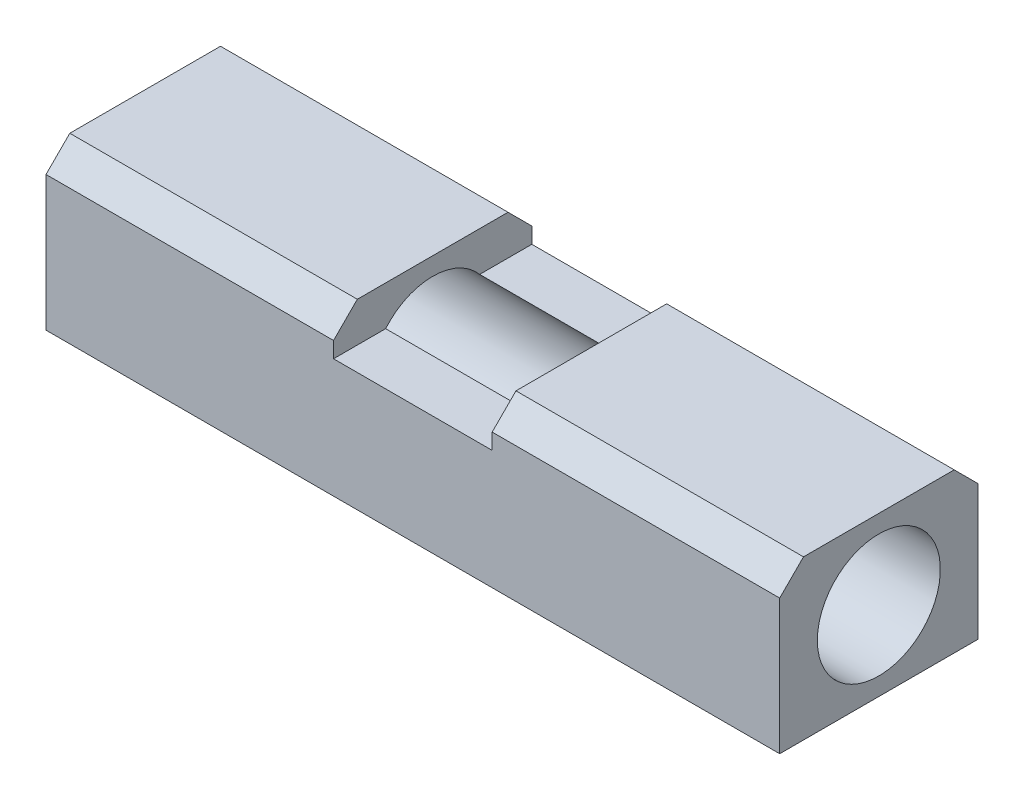
ISO-10303-21;
HEADER;
FILE_DESCRIPTION(('STEP AP214'),'2;1');
FILE_NAME('part.step','',(''),(''),'','','');
FILE_SCHEMA(('AUTOMOTIVE_DESIGN { 1 0 10303 214 1 1 1 1 }'));
ENDSEC;
DATA;
#1=APPLICATION_CONTEXT('core data for automotive mechanical design processes');
#2=APPLICATION_PROTOCOL_DEFINITION('international standard','automotive_design',2000,#1);
#3=PRODUCT_CONTEXT('',#1,'mechanical');
#4=PRODUCT('Part','Part','',(#3));
#5=PRODUCT_RELATED_PRODUCT_CATEGORY('part','',(#4));
#6=PRODUCT_DEFINITION_FORMATION('','',#4);
#7=PRODUCT_DEFINITION_CONTEXT('part definition',#1,'design');
#8=PRODUCT_DEFINITION('design','',#6,#7);
#9=PRODUCT_DEFINITION_SHAPE('','',#8);
#10=(LENGTH_UNIT() NAMED_UNIT(*) SI_UNIT(.MILLI.,.METRE.));
#11=(NAMED_UNIT(*) PLANE_ANGLE_UNIT() SI_UNIT($,.RADIAN.));
#12=(NAMED_UNIT(*) SI_UNIT($,.STERADIAN.) SOLID_ANGLE_UNIT());
#13=UNCERTAINTY_MEASURE_WITH_UNIT(LENGTH_MEASURE(1.E-05),#10,'distance_accuracy_value','');
#14=(GEOMETRIC_REPRESENTATION_CONTEXT(3) GLOBAL_UNCERTAINTY_ASSIGNED_CONTEXT((#13)) GLOBAL_UNIT_ASSIGNED_CONTEXT((#10,
#11,#12)) REPRESENTATION_CONTEXT('',''));
#15=CARTESIAN_POINT('',(0.,0.,0.));
#16=DIRECTION('',(0.,0.,1.));
#17=DIRECTION('',(1.,0.,0.));
#18=AXIS2_PLACEMENT_3D('',#15,#16,#17);
#19=CARTESIAN_POINT('',(0.,40.,50.));
#20=DIRECTION('',(0.,-1.,0.));
#21=DIRECTION('',(0.,0.,-1.));
#22=AXIS2_PLACEMENT_3D('',#19,#20,#21);
#23=PLANE('',#22);
#24=DIRECTION('',(1.,0.,0.));
#25=VECTOR('',#24,1.);
#26=CARTESIAN_POINT('',(0.,40.,44.));
#27=LINE('',#26,#25);
#28=CARTESIAN_POINT('',(0.,40.,44.));
#29=VERTEX_POINT('',#28);
#30=CARTESIAN_POINT('',(72.5,40.,44.));
#31=VERTEX_POINT('',#30);
#32=EDGE_CURVE('E250',#29,#31,#27,.T.);
#33=ORIENTED_EDGE('',*,*,#32,.T.);
#34=DIRECTION('',(0.,0.,1.));
#35=VECTOR('',#34,1.);
#36=CARTESIAN_POINT('',(72.5,40.,0.));
#37=LINE('',#36,#35);
#38=CARTESIAN_POINT('',(72.5,40.,6.00000000000001));
#39=VERTEX_POINT('',#38);
#40=EDGE_CURVE('E169',#39,#31,#37,.T.);
#41=ORIENTED_EDGE('',*,*,#40,.F.);
#42=DIRECTION('',(-1.,0.,0.));
#43=VECTOR('',#42,1.);
#44=CARTESIAN_POINT('',(0.,40.,6.00000000000001));
#45=LINE('',#44,#43);
#46=CARTESIAN_POINT('',(0.,40.,6.));
#47=VERTEX_POINT('',#46);
#48=EDGE_CURVE('E245',#39,#47,#45,.T.);
#49=ORIENTED_EDGE('',*,*,#48,.T.);
#50=DIRECTION('',(0.,0.,-1.));
#51=VECTOR('',#50,1.);
#52=CARTESIAN_POINT('',(0.,40.,50.));
#53=LINE('',#52,#51);
#54=EDGE_CURVE('E220',#29,#47,#53,.T.);
#55=ORIENTED_EDGE('',*,*,#54,.F.);
#56=EDGE_LOOP('',(#33,#41,#49,#55));
#57=FACE_BOUND('',#56,.T.);
#58=ADVANCED_FACE('F33',(#57),#23,.F.);
#59=CARTESIAN_POINT('',(0.,34.,50.));
#60=DIRECTION('',(0.,-0.707106781186549,-0.707106781186546));
#61=DIRECTION('',(0.,0.707106781186546,-0.707106781186549));
#62=AXIS2_PLACEMENT_3D('',#59,#60,#61);
#63=PLANE('',#62);
#64=DIRECTION('',(0.,0.707106781186546,-0.707106781186549));
#65=VECTOR('',#64,1.);
#66=CARTESIAN_POINT('',(72.5,34.,50.));
#67=LINE('',#66,#65);
#68=CARTESIAN_POINT('',(72.5,34.,50.));
#69=VERTEX_POINT('',#68);
#70=EDGE_CURVE('E178',#31,#69,#67,.F.);
#71=ORIENTED_EDGE('',*,*,#70,.F.);
#72=ORIENTED_EDGE('',*,*,#32,.F.);
#73=DIRECTION('',(0.,-0.707106781186546,0.707106781186549));
#74=VECTOR('',#73,1.);
#75=CARTESIAN_POINT('',(0.,34.,50.));
#76=LINE('',#75,#74);
#77=CARTESIAN_POINT('',(0.,34.,50.));
#78=VERTEX_POINT('',#77);
#79=EDGE_CURVE('E243',#78,#29,#76,.F.);
#80=ORIENTED_EDGE('',*,*,#79,.F.);
#81=DIRECTION('',(-1.,0.,0.));
#82=VECTOR('',#81,1.);
#83=CARTESIAN_POINT('',(0.,34.,50.));
#84=LINE('',#83,#82);
#85=EDGE_CURVE('E237',#69,#78,#84,.T.);
#86=ORIENTED_EDGE('',*,*,#85,.F.);
#87=EDGE_LOOP('',(#71,#72,#80,#86));
#88=FACE_BOUND('',#87,.T.);
#89=ADVANCED_FACE('F308',(#88),#63,.F.);
#90=CARTESIAN_POINT('',(0.,40.,6.00000000000001));
#91=DIRECTION('',(0.,0.707106781186546,-0.707106781186549));
#92=DIRECTION('',(0.,0.707106781186549,0.707106781186546));
#93=AXIS2_PLACEMENT_3D('',#90,#91,#92);
#94=PLANE('',#93);
#95=DIRECTION('',(0.,0.707106781186549,0.707106781186546));
#96=VECTOR('',#95,1.);
#97=CARTESIAN_POINT('',(72.5,40.,5.99999999999995));
#98=LINE('',#97,#96);
#99=CARTESIAN_POINT('',(72.5,34.,0.));
#100=VERTEX_POINT('',#99);
#101=EDGE_CURVE('E261',#100,#39,#98,.T.);
#102=ORIENTED_EDGE('',*,*,#101,.F.);
#103=DIRECTION('',(1.,0.,0.));
#104=VECTOR('',#103,1.);
#105=CARTESIAN_POINT('',(185.,34.,0.));
#106=LINE('',#105,#104);
#107=CARTESIAN_POINT('',(0.,34.,0.));
#108=VERTEX_POINT('',#107);
#109=EDGE_CURVE('E157',#108,#100,#106,.T.);
#110=ORIENTED_EDGE('',*,*,#109,.F.);
#111=DIRECTION('',(0.,-0.707106781186549,-0.707106781186546));
#112=VECTOR('',#111,1.);
#113=CARTESIAN_POINT('',(0.,40.,6.00000000000001));
#114=LINE('',#113,#112);
#115=EDGE_CURVE('E241',#47,#108,#114,.T.);
#116=ORIENTED_EDGE('',*,*,#115,.F.);
#117=ORIENTED_EDGE('',*,*,#48,.F.);
#118=EDGE_LOOP('',(#102,#110,#116,#117));
#119=FACE_BOUND('',#118,.T.);
#120=ADVANCED_FACE('F301',(#119),#94,.T.);
#121=CARTESIAN_POINT('',(0.,0.,50.));
#122=DIRECTION('',(1.,0.,0.));
#123=DIRECTION('',(0.,0.,-1.));
#124=AXIS2_PLACEMENT_3D('',#121,#122,#123);
#125=PLANE('',#124);
#126=CARTESIAN_POINT('',(0.,20.,25.));
#127=DIRECTION('',(-1.,0.,0.));
#128=DIRECTION('',(0.,0.,1.));
#129=AXIS2_PLACEMENT_3D('',#126,#127,#128);
#130=CIRCLE('',#129,15.5091839996387);
#131=CARTESIAN_POINT('',(0.,20.,40.5091839996387));
#132=VERTEX_POINT('',#131);
#133=EDGE_CURVE('E203',#132,#132,#130,.T.);
#134=ORIENTED_EDGE('',*,*,#133,.F.);
#135=EDGE_LOOP('',(#134));
#136=FACE_BOUND('',#135,.T.);
#137=DIRECTION('',(0.,-1.,0.));
#138=VECTOR('',#137,1.);
#139=CARTESIAN_POINT('',(0.,0.,50.));
#140=LINE('',#139,#138);
#141=CARTESIAN_POINT('',(0.,0.,50.));
#142=VERTEX_POINT('',#141);
#143=EDGE_CURVE('E212',#78,#142,#140,.T.);
#144=ORIENTED_EDGE('',*,*,#143,.F.);
#145=ORIENTED_EDGE('',*,*,#79,.T.);
#146=ORIENTED_EDGE('',*,*,#54,.T.);
#147=ORIENTED_EDGE('',*,*,#115,.T.);
#148=DIRECTION('',(0.,-1.,0.));
#149=VECTOR('',#148,1.);
#150=CARTESIAN_POINT('',(0.,0.,0.));
#151=LINE('',#150,#149);
#152=CARTESIAN_POINT('',(0.,0.,0.));
#153=VERTEX_POINT('',#152);
#154=EDGE_CURVE('E209',#108,#153,#151,.T.);
#155=ORIENTED_EDGE('',*,*,#154,.T.);
#156=DIRECTION('',(0.,0.,-1.));
#157=VECTOR('',#156,1.);
#158=CARTESIAN_POINT('',(0.,0.,50.));
#159=LINE('',#158,#157);
#160=EDGE_CURVE('E234',#142,#153,#159,.T.);
#161=ORIENTED_EDGE('',*,*,#160,.F.);
#162=EDGE_LOOP('',(#144,#145,#146,#147,#155,#161));
#163=FACE_BOUND('',#162,.T.);
#164=ADVANCED_FACE('F296',(#136,#163),#125,.F.);
#165=CARTESIAN_POINT('',(0.,0.,50.));
#166=DIRECTION('',(0.,1.,0.));
#167=DIRECTION('',(0.,0.,1.));
#168=AXIS2_PLACEMENT_3D('',#165,#166,#167);
#169=PLANE('',#168);
#170=CARTESIAN_POINT('',(179.,0.,44.));
#171=DIRECTION('',(0.,-1.,0.));
#172=DIRECTION('',(0.,0.,1.));
#173=AXIS2_PLACEMENT_3D('',#170,#171,#172);
#174=CIRCLE('',#173,2.);
#175=CARTESIAN_POINT('',(179.,0.,46.));
#176=VERTEX_POINT('',#175);
#177=EDGE_CURVE('E181',#176,#176,#174,.T.);
#178=ORIENTED_EDGE('',*,*,#177,.F.);
#179=EDGE_LOOP('',(#178));
#180=FACE_BOUND('',#179,.T.);
#181=CARTESIAN_POINT('',(179.,0.,6.00000000000002));
#182=DIRECTION('',(0.,-1.,0.));
#183=DIRECTION('',(0.,0.,-1.));
#184=AXIS2_PLACEMENT_3D('',#181,#182,#183);
#185=CIRCLE('',#184,2.);
#186=CARTESIAN_POINT('',(179.,0.,4.00000000000002));
#187=VERTEX_POINT('',#186);
#188=EDGE_CURVE('E185',#187,#187,#185,.T.);
#189=ORIENTED_EDGE('',*,*,#188,.F.);
#190=EDGE_LOOP('',(#189));
#191=FACE_BOUND('',#190,.T.);
#192=CARTESIAN_POINT('',(6.,0.,6.));
#193=DIRECTION('',(0.,-1.,0.));
#194=DIRECTION('',(0.,0.,1.));
#195=AXIS2_PLACEMENT_3D('',#192,#193,#194);
#196=CIRCLE('',#195,2.);
#197=CARTESIAN_POINT('',(6.,0.,8.));
#198=VERTEX_POINT('',#197);
#199=EDGE_CURVE('E191',#198,#198,#196,.T.);
#200=ORIENTED_EDGE('',*,*,#199,.F.);
#201=EDGE_LOOP('',(#200));
#202=FACE_BOUND('',#201,.T.);
#203=CARTESIAN_POINT('',(6.,0.,44.));
#204=DIRECTION('',(0.,-1.,0.));
#205=DIRECTION('',(0.,0.,-1.));
#206=AXIS2_PLACEMENT_3D('',#203,#204,#205);
#207=CIRCLE('',#206,2.);
#208=CARTESIAN_POINT('',(6.,0.,42.));
#209=VERTEX_POINT('',#208);
#210=EDGE_CURVE('E197',#209,#209,#207,.T.);
#211=ORIENTED_EDGE('',*,*,#210,.F.);
#212=EDGE_LOOP('',(#211));
#213=FACE_BOUND('',#212,.T.);
#214=DIRECTION('',(1.,0.,0.));
#215=VECTOR('',#214,1.);
#216=CARTESIAN_POINT('',(0.,0.,0.));
#217=LINE('',#216,#215);
#218=CARTESIAN_POINT('',(185.,0.,0.));
#219=VERTEX_POINT('',#218);
#220=EDGE_CURVE('E222',#153,#219,#217,.T.);
#221=ORIENTED_EDGE('',*,*,#220,.T.);
#222=DIRECTION('',(0.,0.,-1.));
#223=VECTOR('',#222,1.);
#224=CARTESIAN_POINT('',(185.,0.,50.));
#225=LINE('',#224,#223);
#226=CARTESIAN_POINT('',(185.,0.,50.));
#227=VERTEX_POINT('',#226);
#228=EDGE_CURVE('E231',#227,#219,#225,.T.);
#229=ORIENTED_EDGE('',*,*,#228,.F.);
#230=DIRECTION('',(1.,0.,0.));
#231=VECTOR('',#230,1.);
#232=CARTESIAN_POINT('',(0.,0.,50.));
#233=LINE('',#232,#231);
#234=EDGE_CURVE('E214',#142,#227,#233,.T.);
#235=ORIENTED_EDGE('',*,*,#234,.F.);
#236=ORIENTED_EDGE('',*,*,#160,.T.);
#237=EDGE_LOOP('',(#221,#229,#235,#236));
#238=FACE_BOUND('',#237,.T.);
#239=ADVANCED_FACE('F293',(#180,#191,#202,#213,#238),#169,.F.);
#240=CARTESIAN_POINT('',(185.,0.,50.));
#241=DIRECTION('',(-1.,0.,0.));
#242=DIRECTION('',(0.,0.,1.));
#243=AXIS2_PLACEMENT_3D('',#240,#241,#242);
#244=PLANE('',#243);
#245=CARTESIAN_POINT('',(185.,20.,25.));
#246=DIRECTION('',(-1.,0.,0.));
#247=DIRECTION('',(0.,0.,1.));
#248=AXIS2_PLACEMENT_3D('',#245,#246,#247);
#249=CIRCLE('',#248,15.5091839996387);
#250=CARTESIAN_POINT('',(185.,20.,40.5091839996387));
#251=VERTEX_POINT('',#250);
#252=EDGE_CURVE('E206',#251,#251,#249,.T.);
#253=ORIENTED_EDGE('',*,*,#252,.T.);
#254=EDGE_LOOP('',(#253));
#255=FACE_BOUND('',#254,.T.);
#256=DIRECTION('',(0.,0.,-1.));
#257=VECTOR('',#256,1.);
#258=CARTESIAN_POINT('',(185.,40.,50.));
#259=LINE('',#258,#257);
#260=CARTESIAN_POINT('',(185.,40.,44.));
#261=VERTEX_POINT('',#260);
#262=CARTESIAN_POINT('',(185.,40.,6.));
#263=VERTEX_POINT('',#262);
#264=EDGE_CURVE('E228',#261,#263,#259,.T.);
#265=ORIENTED_EDGE('',*,*,#264,.F.);
#266=DIRECTION('',(0.,0.707106781186546,-0.707106781186549));
#267=VECTOR('',#266,1.);
#268=CARTESIAN_POINT('',(185.,34.,50.));
#269=LINE('',#268,#267);
#270=CARTESIAN_POINT('',(185.,34.,50.));
#271=VERTEX_POINT('',#270);
#272=EDGE_CURVE('E255',#261,#271,#269,.F.);
#273=ORIENTED_EDGE('',*,*,#272,.T.);
#274=DIRECTION('',(0.,1.,0.));
#275=VECTOR('',#274,1.);
#276=CARTESIAN_POINT('',(185.,0.,50.));
#277=LINE('',#276,#275);
#278=EDGE_CURVE('E217',#227,#271,#277,.T.);
#279=ORIENTED_EDGE('',*,*,#278,.F.);
#280=ORIENTED_EDGE('',*,*,#228,.T.);
#281=DIRECTION('',(0.,1.,0.));
#282=VECTOR('',#281,1.);
#283=CARTESIAN_POINT('',(185.,0.,0.));
#284=LINE('',#283,#282);
#285=CARTESIAN_POINT('',(185.,34.,0.));
#286=VERTEX_POINT('',#285);
#287=EDGE_CURVE('E215',#219,#286,#284,.T.);
#288=ORIENTED_EDGE('',*,*,#287,.T.);
#289=DIRECTION('',(0.,0.707106781186549,0.707106781186546));
#290=VECTOR('',#289,1.);
#291=CARTESIAN_POINT('',(185.,40.,6.00000000000001));
#292=LINE('',#291,#290);
#293=EDGE_CURVE('E253',#286,#263,#292,.T.);
#294=ORIENTED_EDGE('',*,*,#293,.T.);
#295=EDGE_LOOP('',(#265,#273,#279,#280,#288,#294));
#296=FACE_BOUND('',#295,.T.);
#297=ADVANCED_FACE('F274',(#255,#296),#244,.F.);
#298=CARTESIAN_POINT('',(112.5,40.,6.00000000000001));
#299=VERTEX_POINT('',#298);
#300=EDGE_CURVE('E246',#263,#299,#45,.T.);
#301=ORIENTED_EDGE('',*,*,#300,.T.);
#302=DIRECTION('',(0.,0.,1.));
#303=VECTOR('',#302,1.);
#304=CARTESIAN_POINT('',(112.5,40.,0.));
#305=LINE('',#304,#303);
#306=CARTESIAN_POINT('',(112.5,40.,44.));
#307=VERTEX_POINT('',#306);
#308=EDGE_CURVE('E56',#299,#307,#305,.T.);
#309=ORIENTED_EDGE('',*,*,#308,.T.);
#310=EDGE_CURVE('E249',#307,#261,#27,.T.);
#311=ORIENTED_EDGE('',*,*,#310,.T.);
#312=ORIENTED_EDGE('',*,*,#264,.T.);
#313=EDGE_LOOP('',(#301,#309,#311,#312));
#314=FACE_BOUND('',#313,.T.);
#315=ADVANCED_FACE('F277',(#314),#23,.F.);
#316=CARTESIAN_POINT('',(0.,40.,50.));
#317=DIRECTION('',(0.,0.,-1.));
#318=DIRECTION('',(-1.,0.,0.));
#319=AXIS2_PLACEMENT_3D('',#316,#317,#318);
#320=PLANE('',#319);
#321=DIRECTION('',(1.,0.,0.));
#322=VECTOR('',#321,1.);
#323=CARTESIAN_POINT('',(72.5,30.,50.));
#324=LINE('',#323,#322);
#325=CARTESIAN_POINT('',(72.5,30.,50.));
#326=VERTEX_POINT('',#325);
#327=CARTESIAN_POINT('',(112.5,30.,50.));
#328=VERTEX_POINT('',#327);
#329=EDGE_CURVE('E160',#326,#328,#324,.T.);
#330=ORIENTED_EDGE('',*,*,#329,.F.);
#331=DIRECTION('',(0.,-1.,0.));
#332=VECTOR('',#331,1.);
#333=CARTESIAN_POINT('',(72.5,40.,50.));
#334=LINE('',#333,#332);
#335=EDGE_CURVE('E164',#69,#326,#334,.T.);
#336=ORIENTED_EDGE('',*,*,#335,.F.);
#337=ORIENTED_EDGE('',*,*,#85,.T.);
#338=ORIENTED_EDGE('',*,*,#143,.T.);
#339=ORIENTED_EDGE('',*,*,#234,.T.);
#340=ORIENTED_EDGE('',*,*,#278,.T.);
#341=CARTESIAN_POINT('',(112.5,34.,50.));
#342=VERTEX_POINT('',#341);
#343=EDGE_CURVE('E238',#271,#342,#84,.T.);
#344=ORIENTED_EDGE('',*,*,#343,.T.);
#345=DIRECTION('',(0.,1.,0.));
#346=VECTOR('',#345,1.);
#347=CARTESIAN_POINT('',(112.5,40.,50.));
#348=LINE('',#347,#346);
#349=EDGE_CURVE('E158',#328,#342,#348,.T.);
#350=ORIENTED_EDGE('',*,*,#349,.F.);
#351=EDGE_LOOP('',(#330,#336,#337,#338,#339,#340,#344,#350));
#352=FACE_BOUND('',#351,.T.);
#353=ADVANCED_FACE('F286',(#352),#320,.F.);
#354=CARTESIAN_POINT('',(0.,40.,0.));
#355=DIRECTION('',(0.,0.,-1.));
#356=DIRECTION('',(-1.,0.,0.));
#357=AXIS2_PLACEMENT_3D('',#354,#355,#356);
#358=PLANE('',#357);
#359=DIRECTION('',(0.,-1.,0.));
#360=VECTOR('',#359,1.);
#361=CARTESIAN_POINT('',(72.5,40.,0.));
#362=LINE('',#361,#360);
#363=CARTESIAN_POINT('',(72.5,30.,0.));
#364=VERTEX_POINT('',#363);
#365=EDGE_CURVE('E134',#100,#364,#362,.T.);
#366=ORIENTED_EDGE('',*,*,#365,.T.);
#367=DIRECTION('',(1.,0.,0.));
#368=VECTOR('',#367,1.);
#369=CARTESIAN_POINT('',(72.5,30.,0.));
#370=LINE('',#369,#368);
#371=CARTESIAN_POINT('',(112.5,30.,0.));
#372=VERTEX_POINT('',#371);
#373=EDGE_CURVE('E144',#364,#372,#370,.T.);
#374=ORIENTED_EDGE('',*,*,#373,.T.);
#375=DIRECTION('',(0.,1.,0.));
#376=VECTOR('',#375,1.);
#377=CARTESIAN_POINT('',(112.5,40.,0.));
#378=LINE('',#377,#376);
#379=CARTESIAN_POINT('',(112.5,34.,0.));
#380=VERTEX_POINT('',#379);
#381=EDGE_CURVE('E151',#372,#380,#378,.T.);
#382=ORIENTED_EDGE('',*,*,#381,.T.);
#383=EDGE_CURVE('E257',#380,#286,#106,.T.);
#384=ORIENTED_EDGE('',*,*,#383,.T.);
#385=ORIENTED_EDGE('',*,*,#287,.F.);
#386=ORIENTED_EDGE('',*,*,#220,.F.);
#387=ORIENTED_EDGE('',*,*,#154,.F.);
#388=ORIENTED_EDGE('',*,*,#109,.T.);
#389=EDGE_LOOP('',(#366,#374,#382,#384,#385,#386,#387,#388));
#390=FACE_BOUND('',#389,.T.);
#391=ADVANCED_FACE('F154',(#390),#358,.T.);
#392=CARTESIAN_POINT('',(185.,20.,25.));
#393=DIRECTION('',(-1.,0.,0.));
#394=DIRECTION('',(0.,0.,1.));
#395=AXIS2_PLACEMENT_3D('',#392,#393,#394);
#396=CYLINDRICAL_SURFACE('',#395,15.5091839996387);
#397=CARTESIAN_POINT('',(72.5,20.,25.));
#398=DIRECTION('',(-1.,0.,0.));
#399=DIRECTION('',(0.,-1.,0.));
#400=AXIS2_PLACEMENT_3D('',#397,#398,#399);
#401=CIRCLE('',#400,15.5091839996387);
#402=CARTESIAN_POINT('',(72.5,30.,13.1452630423678));
#403=VERTEX_POINT('',#402);
#404=CARTESIAN_POINT('',(72.5,30.,36.8547369576322));
#405=VERTEX_POINT('',#404);
#406=EDGE_CURVE('E138',#403,#405,#401,.F.);
#407=ORIENTED_EDGE('',*,*,#406,.T.);
#408=DIRECTION('',(-1.,0.,0.));
#409=VECTOR('',#408,1.);
#410=CARTESIAN_POINT('',(185.,30.,36.8547369576322));
#411=LINE('',#410,#409);
#412=CARTESIAN_POINT('',(112.5,30.,36.8547369576322));
#413=VERTEX_POINT('',#412);
#414=EDGE_CURVE('E11',#405,#413,#411,.F.);
#415=ORIENTED_EDGE('',*,*,#414,.T.);
#416=CARTESIAN_POINT('',(112.5,20.,25.));
#417=DIRECTION('',(1.,0.,0.));
#418=DIRECTION('',(0.,1.,0.));
#419=AXIS2_PLACEMENT_3D('',#416,#417,#418);
#420=CIRCLE('',#419,15.5091839996387);
#421=CARTESIAN_POINT('',(112.5,30.,13.1452630423678));
#422=VERTEX_POINT('',#421);
#423=EDGE_CURVE('E175',#413,#422,#420,.F.);
#424=ORIENTED_EDGE('',*,*,#423,.T.);
#425=DIRECTION('',(-1.,0.,0.));
#426=VECTOR('',#425,1.);
#427=CARTESIAN_POINT('',(185.,30.,13.1452630423678));
#428=LINE('',#427,#426);
#429=EDGE_CURVE('E41',#422,#403,#428,.T.);
#430=ORIENTED_EDGE('',*,*,#429,.T.);
#431=EDGE_LOOP('',(#407,#415,#424,#430));
#432=FACE_BOUND('',#431,.T.);
#433=ORIENTED_EDGE('',*,*,#252,.F.);
#434=EDGE_LOOP('',(#433));
#435=FACE_BOUND('',#434,.T.);
#436=ORIENTED_EDGE('',*,*,#133,.T.);
#437=EDGE_LOOP('',(#436));
#438=FACE_BOUND('',#437,.T.);
#439=ADVANCED_FACE('F263',(#432,#435,#438),#396,.F.);
#440=DIRECTION('',(0.,-0.707106781186546,0.707106781186549));
#441=VECTOR('',#440,1.);
#442=CARTESIAN_POINT('',(112.5,33.9999999999999,50.0000000000002));
#443=LINE('',#442,#441);
#444=EDGE_CURVE('E171',#342,#307,#443,.F.);
#445=ORIENTED_EDGE('',*,*,#444,.F.);
#446=ORIENTED_EDGE('',*,*,#343,.F.);
#447=ORIENTED_EDGE('',*,*,#272,.F.);
#448=ORIENTED_EDGE('',*,*,#310,.F.);
#449=EDGE_LOOP('',(#445,#446,#447,#448));
#450=FACE_BOUND('',#449,.T.);
#451=ADVANCED_FACE('F281',(#450),#63,.F.);
#452=DIRECTION('',(0.,-0.707106781186549,-0.707106781186546));
#453=VECTOR('',#452,1.);
#454=CARTESIAN_POINT('',(112.5,39.9999999999998,5.99999999999985));
#455=LINE('',#454,#453);
#456=EDGE_CURVE('E259',#299,#380,#455,.T.);
#457=ORIENTED_EDGE('',*,*,#456,.F.);
#458=ORIENTED_EDGE('',*,*,#300,.F.);
#459=ORIENTED_EDGE('',*,*,#293,.F.);
#460=ORIENTED_EDGE('',*,*,#383,.F.);
#461=EDGE_LOOP('',(#457,#458,#459,#460));
#462=FACE_BOUND('',#461,.T.);
#463=ADVANCED_FACE('F35',(#462),#94,.T.);
#464=CARTESIAN_POINT('',(6.,15.,44.));
#465=DIRECTION('',(0.,-1.,0.));
#466=DIRECTION('',(0.,0.,-1.));
#467=AXIS2_PLACEMENT_3D('',#464,#465,#466);
#468=CYLINDRICAL_SURFACE('',#467,2.);
#469=CARTESIAN_POINT('',(6.,15.,44.));
#470=DIRECTION('',(0.,-1.,0.));
#471=DIRECTION('',(0.,0.,-1.));
#472=AXIS2_PLACEMENT_3D('',#469,#470,#471);
#473=CIRCLE('',#472,2.);
#474=CARTESIAN_POINT('',(6.,15.,42.));
#475=VERTEX_POINT('',#474);
#476=EDGE_CURVE('E200',#475,#475,#473,.T.);
#477=ORIENTED_EDGE('',*,*,#476,.F.);
#478=EDGE_LOOP('',(#477));
#479=FACE_BOUND('',#478,.T.);
#480=ORIENTED_EDGE('',*,*,#210,.T.);
#481=EDGE_LOOP('',(#480));
#482=FACE_BOUND('',#481,.T.);
#483=ADVANCED_FACE('F352',(#479,#482),#468,.F.);
#484=CARTESIAN_POINT('',(6.,15.,44.));
#485=DIRECTION('',(0.,-1.,0.));
#486=DIRECTION('',(0.,0.,-1.));
#487=AXIS2_PLACEMENT_3D('',#484,#485,#486);
#488=PLANE('',#487);
#489=ORIENTED_EDGE('',*,*,#476,.T.);
#490=EDGE_LOOP('',(#489));
#491=FACE_BOUND('',#490,.T.);
#492=ADVANCED_FACE('F360',(#491),#488,.T.);
#493=CARTESIAN_POINT('',(6.,15.,6.));
#494=DIRECTION('',(0.,-1.,0.));
#495=DIRECTION('',(0.,0.,-1.));
#496=AXIS2_PLACEMENT_3D('',#493,#494,#495);
#497=CYLINDRICAL_SURFACE('',#496,2.);
#498=CARTESIAN_POINT('',(6.,15.,6.));
#499=DIRECTION('',(0.,-1.,0.));
#500=DIRECTION('',(0.,0.,1.));
#501=AXIS2_PLACEMENT_3D('',#498,#499,#500);
#502=CIRCLE('',#501,2.);
#503=CARTESIAN_POINT('',(6.,15.,8.));
#504=VERTEX_POINT('',#503);
#505=EDGE_CURVE('E194',#504,#504,#502,.T.);
#506=ORIENTED_EDGE('',*,*,#505,.F.);
#507=EDGE_LOOP('',(#506));
#508=FACE_BOUND('',#507,.T.);
#509=ORIENTED_EDGE('',*,*,#199,.T.);
#510=EDGE_LOOP('',(#509));
#511=FACE_BOUND('',#510,.T.);
#512=ADVANCED_FACE('F364',(#508,#511),#497,.F.);
#513=CARTESIAN_POINT('',(6.,15.,6.));
#514=DIRECTION('',(0.,1.,0.));
#515=DIRECTION('',(0.,0.,1.));
#516=AXIS2_PLACEMENT_3D('',#513,#514,#515);
#517=PLANE('',#516);
#518=ORIENTED_EDGE('',*,*,#505,.T.);
#519=EDGE_LOOP('',(#518));
#520=FACE_BOUND('',#519,.T.);
#521=ADVANCED_FACE('F368',(#520),#517,.F.);
#522=CARTESIAN_POINT('',(179.,15.,6.00000000000002));
#523=DIRECTION('',(0.,-1.,0.));
#524=DIRECTION('',(0.,0.,-1.));
#525=AXIS2_PLACEMENT_3D('',#522,#523,#524);
#526=CYLINDRICAL_SURFACE('',#525,2.);
#527=CARTESIAN_POINT('',(179.,15.,6.00000000000002));
#528=DIRECTION('',(0.,-1.,0.));
#529=DIRECTION('',(0.,0.,-1.));
#530=AXIS2_PLACEMENT_3D('',#527,#528,#529);
#531=CIRCLE('',#530,2.);
#532=CARTESIAN_POINT('',(179.,15.,4.00000000000002));
#533=VERTEX_POINT('',#532);
#534=EDGE_CURVE('E188',#533,#533,#531,.T.);
#535=ORIENTED_EDGE('',*,*,#534,.F.);
#536=EDGE_LOOP('',(#535));
#537=FACE_BOUND('',#536,.T.);
#538=ORIENTED_EDGE('',*,*,#188,.T.);
#539=EDGE_LOOP('',(#538));
#540=FACE_BOUND('',#539,.T.);
#541=ADVANCED_FACE('F372',(#537,#540),#526,.F.);
#542=CARTESIAN_POINT('',(179.,15.,6.00000000000002));
#543=DIRECTION('',(0.,-1.,0.));
#544=DIRECTION('',(0.,0.,-1.));
#545=AXIS2_PLACEMENT_3D('',#542,#543,#544);
#546=PLANE('',#545);
#547=ORIENTED_EDGE('',*,*,#534,.T.);
#548=EDGE_LOOP('',(#547));
#549=FACE_BOUND('',#548,.T.);
#550=ADVANCED_FACE('F376',(#549),#546,.T.);
#551=CARTESIAN_POINT('',(179.,15.,44.));
#552=DIRECTION('',(0.,-1.,0.));
#553=DIRECTION('',(0.,0.,-1.));
#554=AXIS2_PLACEMENT_3D('',#551,#552,#553);
#555=CYLINDRICAL_SURFACE('',#554,2.);
#556=CARTESIAN_POINT('',(179.,15.,44.));
#557=DIRECTION('',(0.,-1.,0.));
#558=DIRECTION('',(0.,0.,1.));
#559=AXIS2_PLACEMENT_3D('',#556,#557,#558);
#560=CIRCLE('',#559,2.);
#561=CARTESIAN_POINT('',(179.,15.,46.));
#562=VERTEX_POINT('',#561);
#563=EDGE_CURVE('E182',#562,#562,#560,.T.);
#564=ORIENTED_EDGE('',*,*,#563,.F.);
#565=EDGE_LOOP('',(#564));
#566=FACE_BOUND('',#565,.T.);
#567=ORIENTED_EDGE('',*,*,#177,.T.);
#568=EDGE_LOOP('',(#567));
#569=FACE_BOUND('',#568,.T.);
#570=ADVANCED_FACE('F320',(#566,#569),#555,.F.);
#571=CARTESIAN_POINT('',(179.,15.,44.));
#572=DIRECTION('',(0.,1.,0.));
#573=DIRECTION('',(0.,0.,1.));
#574=AXIS2_PLACEMENT_3D('',#571,#572,#573);
#575=PLANE('',#574);
#576=ORIENTED_EDGE('',*,*,#563,.T.);
#577=EDGE_LOOP('',(#576));
#578=FACE_BOUND('',#577,.T.);
#579=ADVANCED_FACE('F314',(#578),#575,.F.);
#580=CARTESIAN_POINT('',(72.5,30.,0.));
#581=DIRECTION('',(0.,-1.,0.));
#582=DIRECTION('',(0.,0.,-1.));
#583=AXIS2_PLACEMENT_3D('',#580,#581,#582);
#584=PLANE('',#583);
#585=DIRECTION('',(0.,0.,1.));
#586=VECTOR('',#585,1.);
#587=CARTESIAN_POINT('',(72.5,30.,0.));
#588=LINE('',#587,#586);
#589=EDGE_CURVE('E141',#405,#326,#588,.T.);
#590=ORIENTED_EDGE('',*,*,#589,.T.);
#591=ORIENTED_EDGE('',*,*,#329,.T.);
#592=DIRECTION('',(0.,0.,1.));
#593=VECTOR('',#592,1.);
#594=CARTESIAN_POINT('',(112.5,30.,0.));
#595=LINE('',#594,#593);
#596=EDGE_CURVE('E140',#413,#328,#595,.T.);
#597=ORIENTED_EDGE('',*,*,#596,.F.);
#598=ORIENTED_EDGE('',*,*,#414,.F.);
#599=EDGE_LOOP('',(#590,#591,#597,#598));
#600=FACE_BOUND('',#599,.T.);
#601=ADVANCED_FACE('F312',(#600),#584,.F.);
#602=EDGE_CURVE('E147',#372,#422,#595,.T.);
#603=ORIENTED_EDGE('',*,*,#602,.F.);
#604=ORIENTED_EDGE('',*,*,#373,.F.);
#605=EDGE_CURVE('E48',#364,#403,#588,.T.);
#606=ORIENTED_EDGE('',*,*,#605,.T.);
#607=ORIENTED_EDGE('',*,*,#429,.F.);
#608=EDGE_LOOP('',(#603,#604,#606,#607));
#609=FACE_BOUND('',#608,.T.);
#610=ADVANCED_FACE('F145',(#609),#584,.F.);
#611=CARTESIAN_POINT('',(72.5,40.,0.));
#612=DIRECTION('',(-1.,0.,0.));
#613=DIRECTION('',(0.,-1.,0.));
#614=AXIS2_PLACEMENT_3D('',#611,#612,#613);
#615=PLANE('',#614);
#616=ORIENTED_EDGE('',*,*,#605,.F.);
#617=ORIENTED_EDGE('',*,*,#365,.F.);
#618=ORIENTED_EDGE('',*,*,#101,.T.);
#619=ORIENTED_EDGE('',*,*,#40,.T.);
#620=ORIENTED_EDGE('',*,*,#70,.T.);
#621=ORIENTED_EDGE('',*,*,#335,.T.);
#622=ORIENTED_EDGE('',*,*,#589,.F.);
#623=ORIENTED_EDGE('',*,*,#406,.F.);
#624=EDGE_LOOP('',(#616,#617,#618,#619,#620,#621,#622,#623));
#625=FACE_BOUND('',#624,.T.);
#626=ADVANCED_FACE('F132',(#625),#615,.F.);
#627=CARTESIAN_POINT('',(112.5,40.,0.));
#628=DIRECTION('',(1.,0.,0.));
#629=DIRECTION('',(0.,1.,0.));
#630=AXIS2_PLACEMENT_3D('',#627,#628,#629);
#631=PLANE('',#630);
#632=ORIENTED_EDGE('',*,*,#596,.T.);
#633=ORIENTED_EDGE('',*,*,#349,.T.);
#634=ORIENTED_EDGE('',*,*,#444,.T.);
#635=ORIENTED_EDGE('',*,*,#308,.F.);
#636=ORIENTED_EDGE('',*,*,#456,.T.);
#637=ORIENTED_EDGE('',*,*,#381,.F.);
#638=ORIENTED_EDGE('',*,*,#602,.T.);
#639=ORIENTED_EDGE('',*,*,#423,.F.);
#640=EDGE_LOOP('',(#632,#633,#634,#635,#636,#637,#638,#639));
#641=FACE_BOUND('',#640,.T.);
#642=ADVANCED_FACE('F265',(#641),#631,.F.);
#643=CLOSED_SHELL('',(#58,#89,#120,#164,#239,#297,#315,#353,#391,#439,#451,#463,#483,#492,#512,
#521,#541,#550,#570,#579,#601,#610,#626,#642));
#644=MANIFOLD_SOLID_BREP('B2',#643);
#645=ADVANCED_BREP_SHAPE_REPRESENTATION('',(#18,#644),#14);
#646=SHAPE_DEFINITION_REPRESENTATION(#9,#645);
ENDSEC;
END-ISO-10303-21;
